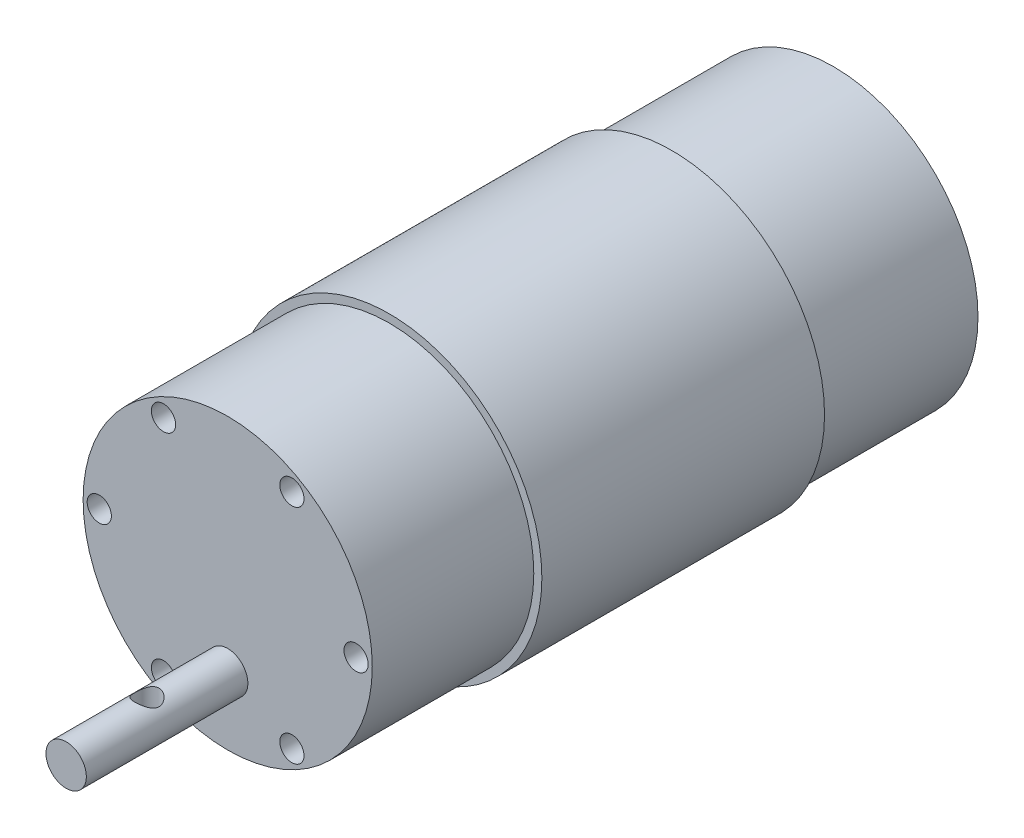
ISO-10303-21;
HEADER;
FILE_DESCRIPTION(('STEP AP214'),'2;1');
FILE_NAME('part.step','',(''),(''),'','','');
FILE_SCHEMA(('AUTOMOTIVE_DESIGN { 1 0 10303 214 1 1 1 1 }'));
ENDSEC;
DATA;
#1=APPLICATION_CONTEXT('core data for automotive mechanical design processes');
#2=APPLICATION_PROTOCOL_DEFINITION('international standard','automotive_design',2000,#1);
#3=PRODUCT_CONTEXT('',#1,'mechanical');
#4=PRODUCT('Part','Part','',(#3));
#5=PRODUCT_RELATED_PRODUCT_CATEGORY('part','',(#4));
#6=PRODUCT_DEFINITION_FORMATION('','',#4);
#7=PRODUCT_DEFINITION_CONTEXT('part definition',#1,'design');
#8=PRODUCT_DEFINITION('design','',#6,#7);
#9=PRODUCT_DEFINITION_SHAPE('','',#8);
#10=(LENGTH_UNIT() NAMED_UNIT(*) SI_UNIT(.MILLI.,.METRE.));
#11=(NAMED_UNIT(*) PLANE_ANGLE_UNIT() SI_UNIT($,.RADIAN.));
#12=(NAMED_UNIT(*) SI_UNIT($,.STERADIAN.) SOLID_ANGLE_UNIT());
#13=UNCERTAINTY_MEASURE_WITH_UNIT(LENGTH_MEASURE(1.E-05),#10,'distance_accuracy_value','');
#14=(GEOMETRIC_REPRESENTATION_CONTEXT(3) GLOBAL_UNCERTAINTY_ASSIGNED_CONTEXT((#13)) GLOBAL_UNIT_ASSIGNED_CONTEXT((#10,
#11,#12)) REPRESENTATION_CONTEXT('',''));
#15=CARTESIAN_POINT('',(0.,0.,0.));
#16=DIRECTION('',(0.,0.,1.));
#17=DIRECTION('',(1.,0.,0.));
#18=AXIS2_PLACEMENT_3D('',#15,#16,#17);
#19=CARTESIAN_POINT('',(0.,0.,75.));
#20=DIRECTION('',(0.,0.,-1.));
#21=DIRECTION('',(-1.,0.,0.));
#22=AXIS2_PLACEMENT_3D('',#19,#20,#21);
#23=CYLINDRICAL_SURFACE('',#22,18.9);
#24=CARTESIAN_POINT('',(0.,0.,55.));
#25=DIRECTION('',(0.,0.,1.));
#26=DIRECTION('',(1.,0.,0.));
#27=AXIS2_PLACEMENT_3D('',#24,#25,#26);
#28=CIRCLE('',#27,18.9);
#29=CARTESIAN_POINT('',(18.9,0.,55.));
#30=VERTEX_POINT('',#29);
#31=EDGE_CURVE('E159',#30,#30,#28,.T.);
#32=ORIENTED_EDGE('',*,*,#31,.F.);
#33=EDGE_LOOP('',(#32));
#34=FACE_BOUND('',#33,.T.);
#35=CARTESIAN_POINT('',(0.,0.,20.));
#36=DIRECTION('',(0.,0.,-1.));
#37=DIRECTION('',(-1.,0.,0.));
#38=AXIS2_PLACEMENT_3D('',#35,#36,#37);
#39=CIRCLE('',#38,18.9);
#40=CARTESIAN_POINT('',(-18.9,0.,20.));
#41=VERTEX_POINT('',#40);
#42=EDGE_CURVE('E162',#41,#41,#39,.T.);
#43=ORIENTED_EDGE('',*,*,#42,.F.);
#44=EDGE_LOOP('',(#43));
#45=FACE_BOUND('',#44,.T.);
#46=ADVANCED_FACE('F38',(#34,#45),#23,.T.);
#47=CARTESIAN_POINT('',(0.,0.,75.));
#48=DIRECTION('',(0.,0.,1.));
#49=DIRECTION('',(1.,0.,0.));
#50=AXIS2_PLACEMENT_3D('',#47,#48,#49);
#51=PLANE('',#50);
#52=CARTESIAN_POINT('',(7.94999999999997,-13.7698039201726,75.));
#53=DIRECTION('',(0.,0.,1.));
#54=DIRECTION('',(1.,0.,0.));
#55=AXIS2_PLACEMENT_3D('',#52,#53,#54);
#56=CIRCLE('',#55,1.5);
#57=CARTESIAN_POINT('',(9.44999999999997,-13.7698039201726,75.));
#58=VERTEX_POINT('',#57);
#59=EDGE_CURVE('E79',#58,#58,#56,.T.);
#60=ORIENTED_EDGE('',*,*,#59,.F.);
#61=EDGE_LOOP('',(#60));
#62=FACE_BOUND('',#61,.T.);
#63=CARTESIAN_POINT('',(-7.95000000000007,-13.7698039201725,75.));
#64=DIRECTION('',(0.,0.,1.));
#65=DIRECTION('',(1.,0.,0.));
#66=AXIS2_PLACEMENT_3D('',#63,#64,#65);
#67=CIRCLE('',#66,1.5);
#68=CARTESIAN_POINT('',(-6.45000000000007,-13.7698039201725,75.));
#69=VERTEX_POINT('',#68);
#70=EDGE_CURVE('E87',#69,#69,#67,.T.);
#71=ORIENTED_EDGE('',*,*,#70,.F.);
#72=EDGE_LOOP('',(#71));
#73=FACE_BOUND('',#72,.T.);
#74=CARTESIAN_POINT('',(-15.9,1.11029106575212E-13,75.));
#75=DIRECTION('',(0.,0.,1.));
#76=DIRECTION('',(1.,0.,0.));
#77=AXIS2_PLACEMENT_3D('',#74,#75,#76);
#78=CIRCLE('',#77,1.5);
#79=CARTESIAN_POINT('',(-14.4,1.11029106575212E-13,75.));
#80=VERTEX_POINT('',#79);
#81=EDGE_CURVE('E95',#80,#80,#78,.T.);
#82=ORIENTED_EDGE('',*,*,#81,.F.);
#83=EDGE_LOOP('',(#82));
#84=FACE_BOUND('',#83,.T.);
#85=CARTESIAN_POINT('',(-7.94999999999987,13.7698039201726,75.));
#86=DIRECTION('',(0.,0.,1.));
#87=DIRECTION('',(1.,0.,0.));
#88=AXIS2_PLACEMENT_3D('',#85,#86,#87);
#89=CIRCLE('',#88,1.5);
#90=CARTESIAN_POINT('',(-6.44999999999987,13.7698039201726,75.));
#91=VERTEX_POINT('',#90);
#92=EDGE_CURVE('E71',#91,#91,#89,.T.);
#93=ORIENTED_EDGE('',*,*,#92,.F.);
#94=EDGE_LOOP('',(#93));
#95=FACE_BOUND('',#94,.T.);
#96=CARTESIAN_POINT('',(7.95000000000016,13.7698039201725,75.));
#97=DIRECTION('',(0.,0.,1.));
#98=DIRECTION('',(1.,0.,0.));
#99=AXIS2_PLACEMENT_3D('',#96,#97,#98);
#100=CIRCLE('',#99,1.5);
#101=CARTESIAN_POINT('',(9.45000000000016,13.7698039201725,75.));
#102=VERTEX_POINT('',#101);
#103=EDGE_CURVE('E72',#102,#102,#100,.T.);
#104=ORIENTED_EDGE('',*,*,#103,.F.);
#105=EDGE_LOOP('',(#104));
#106=FACE_BOUND('',#105,.T.);
#107=CARTESIAN_POINT('',(15.9,0.,75.));
#108=DIRECTION('',(0.,0.,1.));
#109=DIRECTION('',(1.,0.,0.));
#110=AXIS2_PLACEMENT_3D('',#107,#108,#109);
#111=CIRCLE('',#110,1.5);
#112=CARTESIAN_POINT('',(17.4,0.,75.));
#113=VERTEX_POINT('',#112);
#114=EDGE_CURVE('E57',#113,#113,#111,.T.);
#115=ORIENTED_EDGE('',*,*,#114,.F.);
#116=EDGE_LOOP('',(#115));
#117=FACE_BOUND('',#116,.T.);
#118=CARTESIAN_POINT('',(0.,-9.5,75.));
#119=DIRECTION('',(0.,0.,1.));
#120=DIRECTION('',(1.,0.,0.));
#121=AXIS2_PLACEMENT_3D('',#118,#119,#120);
#122=CIRCLE('',#121,2.5);
#123=CARTESIAN_POINT('',(2.5,-9.5,75.));
#124=VERTEX_POINT('',#123);
#125=EDGE_CURVE('E10',#124,#124,#122,.T.);
#126=ORIENTED_EDGE('',*,*,#125,.F.);
#127=EDGE_LOOP('',(#126));
#128=FACE_BOUND('',#127,.T.);
#129=CARTESIAN_POINT('',(0.,0.,75.));
#130=DIRECTION('',(0.,0.,1.));
#131=DIRECTION('',(1.,0.,0.));
#132=AXIS2_PLACEMENT_3D('',#129,#130,#131);
#133=CIRCLE('',#132,17.9);
#134=CARTESIAN_POINT('',(17.9,0.,75.));
#135=VERTEX_POINT('',#134);
#136=EDGE_CURVE('E165',#135,#135,#133,.T.);
#137=ORIENTED_EDGE('',*,*,#136,.T.);
#138=EDGE_LOOP('',(#137));
#139=FACE_BOUND('',#138,.T.);
#140=ADVANCED_FACE('F148',(#62,#73,#84,#95,#106,#117,#128,#139),#51,.T.);
#141=CARTESIAN_POINT('',(7.94999999999997,-13.7698039201726,67.));
#142=DIRECTION('',(0.,0.,1.));
#143=DIRECTION('',(1.,0.,0.));
#144=AXIS2_PLACEMENT_3D('',#141,#142,#143);
#145=CYLINDRICAL_SURFACE('',#144,1.5);
#146=CARTESIAN_POINT('',(7.94999999999997,-13.7698039201726,67.));
#147=DIRECTION('',(0.,0.,1.));
#148=DIRECTION('',(1.,0.,0.));
#149=AXIS2_PLACEMENT_3D('',#146,#147,#148);
#150=CIRCLE('',#149,1.5);
#151=CARTESIAN_POINT('',(9.44999999999997,-13.7698039201726,67.));
#152=VERTEX_POINT('',#151);
#153=EDGE_CURVE('E66',#152,#152,#150,.T.);
#154=ORIENTED_EDGE('',*,*,#153,.F.);
#155=EDGE_LOOP('',(#154));
#156=FACE_BOUND('',#155,.T.);
#157=ORIENTED_EDGE('',*,*,#59,.T.);
#158=EDGE_LOOP('',(#157));
#159=FACE_BOUND('',#158,.T.);
#160=ADVANCED_FACE('F153',(#156,#159),#145,.F.);
#161=CARTESIAN_POINT('',(7.94999999999997,-13.7698039201726,67.));
#162=DIRECTION('',(0.,0.,1.));
#163=DIRECTION('',(1.,0.,0.));
#164=AXIS2_PLACEMENT_3D('',#161,#162,#163);
#165=PLANE('',#164);
#166=ORIENTED_EDGE('',*,*,#153,.T.);
#167=EDGE_LOOP('',(#166));
#168=FACE_BOUND('',#167,.T.);
#169=ADVANCED_FACE('F225',(#168),#165,.T.);
#170=CARTESIAN_POINT('',(-7.95000000000007,-13.7698039201725,67.));
#171=DIRECTION('',(0.,0.,1.));
#172=DIRECTION('',(1.,0.,0.));
#173=AXIS2_PLACEMENT_3D('',#170,#171,#172);
#174=CYLINDRICAL_SURFACE('',#173,1.5);
#175=CARTESIAN_POINT('',(-7.95000000000007,-13.7698039201725,67.));
#176=DIRECTION('',(0.,0.,1.));
#177=DIRECTION('',(1.,0.,0.));
#178=AXIS2_PLACEMENT_3D('',#175,#176,#177);
#179=CIRCLE('',#178,1.5);
#180=CARTESIAN_POINT('',(-6.45000000000007,-13.7698039201725,67.));
#181=VERTEX_POINT('',#180);
#182=EDGE_CURVE('E83',#181,#181,#179,.T.);
#183=ORIENTED_EDGE('',*,*,#182,.F.);
#184=EDGE_LOOP('',(#183));
#185=FACE_BOUND('',#184,.T.);
#186=ORIENTED_EDGE('',*,*,#70,.T.);
#187=EDGE_LOOP('',(#186));
#188=FACE_BOUND('',#187,.T.);
#189=ADVANCED_FACE('F222',(#185,#188),#174,.F.);
#190=CARTESIAN_POINT('',(-7.95000000000007,-13.7698039201725,67.));
#191=DIRECTION('',(0.,0.,1.));
#192=DIRECTION('',(1.,0.,0.));
#193=AXIS2_PLACEMENT_3D('',#190,#191,#192);
#194=PLANE('',#193);
#195=ORIENTED_EDGE('',*,*,#182,.T.);
#196=EDGE_LOOP('',(#195));
#197=FACE_BOUND('',#196,.T.);
#198=ADVANCED_FACE('F217',(#197),#194,.T.);
#199=CARTESIAN_POINT('',(-15.9,1.11029106575212E-13,67.));
#200=DIRECTION('',(0.,0.,1.));
#201=DIRECTION('',(1.,0.,0.));
#202=AXIS2_PLACEMENT_3D('',#199,#200,#201);
#203=CYLINDRICAL_SURFACE('',#202,1.5);
#204=CARTESIAN_POINT('',(-15.9,1.11029106575212E-13,67.));
#205=DIRECTION('',(0.,0.,1.));
#206=DIRECTION('',(1.,0.,0.));
#207=AXIS2_PLACEMENT_3D('',#204,#205,#206);
#208=CIRCLE('',#207,1.5);
#209=CARTESIAN_POINT('',(-14.4,1.11029106575212E-13,67.));
#210=VERTEX_POINT('',#209);
#211=EDGE_CURVE('E91',#210,#210,#208,.T.);
#212=ORIENTED_EDGE('',*,*,#211,.F.);
#213=EDGE_LOOP('',(#212));
#214=FACE_BOUND('',#213,.T.);
#215=ORIENTED_EDGE('',*,*,#81,.T.);
#216=EDGE_LOOP('',(#215));
#217=FACE_BOUND('',#216,.T.);
#218=ADVANCED_FACE('F214',(#214,#217),#203,.F.);
#219=CARTESIAN_POINT('',(-15.9,1.11029106575212E-13,67.));
#220=DIRECTION('',(0.,0.,1.));
#221=DIRECTION('',(1.,0.,0.));
#222=AXIS2_PLACEMENT_3D('',#219,#220,#221);
#223=PLANE('',#222);
#224=ORIENTED_EDGE('',*,*,#211,.T.);
#225=EDGE_LOOP('',(#224));
#226=FACE_BOUND('',#225,.T.);
#227=ADVANCED_FACE('F208',(#226),#223,.T.);
#228=CARTESIAN_POINT('',(-7.94999999999987,13.7698039201726,67.));
#229=DIRECTION('',(0.,0.,1.));
#230=DIRECTION('',(1.,0.,0.));
#231=AXIS2_PLACEMENT_3D('',#228,#229,#230);
#232=CYLINDRICAL_SURFACE('',#231,1.5);
#233=CARTESIAN_POINT('',(-7.94999999999987,13.7698039201726,67.));
#234=DIRECTION('',(0.,0.,1.));
#235=DIRECTION('',(1.,0.,0.));
#236=AXIS2_PLACEMENT_3D('',#233,#234,#235);
#237=CIRCLE('',#236,1.5);
#238=CARTESIAN_POINT('',(-6.44999999999987,13.7698039201726,67.));
#239=VERTEX_POINT('',#238);
#240=EDGE_CURVE('E99',#239,#239,#237,.T.);
#241=ORIENTED_EDGE('',*,*,#240,.F.);
#242=EDGE_LOOP('',(#241));
#243=FACE_BOUND('',#242,.T.);
#244=ORIENTED_EDGE('',*,*,#92,.T.);
#245=EDGE_LOOP('',(#244));
#246=FACE_BOUND('',#245,.T.);
#247=ADVANCED_FACE('F204',(#243,#246),#232,.F.);
#248=CARTESIAN_POINT('',(-7.94999999999987,13.7698039201726,67.));
#249=DIRECTION('',(0.,0.,1.));
#250=DIRECTION('',(1.,0.,0.));
#251=AXIS2_PLACEMENT_3D('',#248,#249,#250);
#252=PLANE('',#251);
#253=ORIENTED_EDGE('',*,*,#240,.T.);
#254=EDGE_LOOP('',(#253));
#255=FACE_BOUND('',#254,.T.);
#256=ADVANCED_FACE('F207',(#255),#252,.T.);
#257=CARTESIAN_POINT('',(7.95000000000016,13.7698039201725,67.));
#258=DIRECTION('',(0.,0.,1.));
#259=DIRECTION('',(1.,0.,0.));
#260=AXIS2_PLACEMENT_3D('',#257,#258,#259);
#261=CYLINDRICAL_SURFACE('',#260,1.5);
#262=CARTESIAN_POINT('',(7.95000000000016,13.7698039201725,67.));
#263=DIRECTION('',(0.,0.,1.));
#264=DIRECTION('',(1.,0.,0.));
#265=AXIS2_PLACEMENT_3D('',#262,#263,#264);
#266=CIRCLE('',#265,1.5);
#267=CARTESIAN_POINT('',(9.45000000000016,13.7698039201725,67.));
#268=VERTEX_POINT('',#267);
#269=EDGE_CURVE('E67',#268,#268,#266,.T.);
#270=ORIENTED_EDGE('',*,*,#269,.F.);
#271=EDGE_LOOP('',(#270));
#272=FACE_BOUND('',#271,.T.);
#273=ORIENTED_EDGE('',*,*,#103,.T.);
#274=EDGE_LOOP('',(#273));
#275=FACE_BOUND('',#274,.T.);
#276=ADVANCED_FACE('F212',(#272,#275),#261,.F.);
#277=CARTESIAN_POINT('',(7.95000000000016,13.7698039201725,67.));
#278=DIRECTION('',(0.,0.,1.));
#279=DIRECTION('',(1.,0.,0.));
#280=AXIS2_PLACEMENT_3D('',#277,#278,#279);
#281=PLANE('',#280);
#282=ORIENTED_EDGE('',*,*,#269,.T.);
#283=EDGE_LOOP('',(#282));
#284=FACE_BOUND('',#283,.T.);
#285=ADVANCED_FACE('F238',(#284),#281,.T.);
#286=CARTESIAN_POINT('',(15.9,0.,67.));
#287=DIRECTION('',(0.,0.,1.));
#288=DIRECTION('',(1.,0.,0.));
#289=AXIS2_PLACEMENT_3D('',#286,#287,#288);
#290=CYLINDRICAL_SURFACE('',#289,1.5);
#291=CARTESIAN_POINT('',(15.9,0.,67.));
#292=DIRECTION('',(0.,0.,1.));
#293=DIRECTION('',(1.,0.,0.));
#294=AXIS2_PLACEMENT_3D('',#291,#292,#293);
#295=CIRCLE('',#294,1.5);
#296=CARTESIAN_POINT('',(17.4,0.,67.));
#297=VERTEX_POINT('',#296);
#298=EDGE_CURVE('E51',#297,#297,#295,.T.);
#299=ORIENTED_EDGE('',*,*,#298,.F.);
#300=EDGE_LOOP('',(#299));
#301=FACE_BOUND('',#300,.T.);
#302=ORIENTED_EDGE('',*,*,#114,.T.);
#303=EDGE_LOOP('',(#302));
#304=FACE_BOUND('',#303,.T.);
#305=ADVANCED_FACE('F242',(#301,#304),#290,.F.);
#306=CARTESIAN_POINT('',(15.9,0.,67.));
#307=DIRECTION('',(0.,0.,1.));
#308=DIRECTION('',(1.,0.,0.));
#309=AXIS2_PLACEMENT_3D('',#306,#307,#308);
#310=PLANE('',#309);
#311=ORIENTED_EDGE('',*,*,#298,.T.);
#312=EDGE_LOOP('',(#311));
#313=FACE_BOUND('',#312,.T.);
#314=ADVANCED_FACE('F144',(#313),#310,.T.);
#315=CARTESIAN_POINT('',(0.,-9.5,95.));
#316=DIRECTION('',(0.,0.,-1.));
#317=DIRECTION('',(-1.,0.,0.));
#318=AXIS2_PLACEMENT_3D('',#315,#316,#317);
#319=CYLINDRICAL_SURFACE('',#318,2.5);
#320=CARTESIAN_POINT('',(0.,-12.,86.5));
#321=CARTESIAN_POINT('',(0.0767298334620158,-11.9999962578973,86.4999959089901));
#322=CARTESIAN_POINT('',(0.153582320644179,-11.9964290461501,86.4940713290737));
#323=CARTESIAN_POINT('',(0.30497550953068,-11.9824990360857,86.4706756804847));
#324=CARTESIAN_POINT('',(0.379510034596047,-11.9721194803272,86.4531761381458));
#325=CARTESIAN_POINT('',(0.523751827790841,-11.9456155805449,86.4076136388331));
#326=CARTESIAN_POINT('',(0.593481028226574,-11.9295197327294,86.3796030418368));
#327=CARTESIAN_POINT('',(0.727030318214667,-11.8929536762641,86.314139666859));
#328=CARTESIAN_POINT('',(0.790851869416389,-11.8724845538025,86.2766892330313));
#329=CARTESIAN_POINT('',(0.916299278999319,-11.8270536071909,86.1902251732914));
#330=CARTESIAN_POINT('',(0.977384020081418,-11.8018679219598,86.1405463046486));
#331=CARTESIAN_POINT('',(1.09088270411891,-11.7503043927963,86.0325327961717));
#332=CARTESIAN_POINT('',(1.14328534948113,-11.7239250515357,85.9741870628127));
#333=CARTESIAN_POINT('',(1.24444996762975,-11.6691106699591,85.8420764895033));
#334=CARTESIAN_POINT('',(1.29197766378809,-11.6408201770365,85.7672982290187));
#335=CARTESIAN_POINT('',(1.37361437764897,-11.5893830141212,85.6091534267569));
#336=CARTESIAN_POINT('',(1.4077451733516,-11.5662280227394,85.5258011037524));
#337=CARTESIAN_POINT('',(1.45440601714222,-11.5335462966093,85.3734035493468));
#338=CARTESIAN_POINT('',(1.47016197246826,-11.5220788313759,85.3057640013897));
#339=CARTESIAN_POINT('',(1.49216172340475,-11.505903082955,85.1681962841697));
#340=CARTESIAN_POINT('',(1.49841734556836,-11.5011863964376,85.0982710712455));
#341=CARTESIAN_POINT('',(1.50105508796009,-11.4992092246386,84.9579885057827));
#342=CARTESIAN_POINT('',(1.49741783408419,-11.5019633701272,84.8876305749068));
#343=CARTESIAN_POINT('',(1.48046060478828,-11.5145326144374,84.7487212245724));
#344=CARTESIAN_POINT('',(1.46713334620104,-11.5243530243223,84.6801712041526));
#345=CARTESIAN_POINT('',(1.43173921881793,-11.5495318694426,84.5474697578719));
#346=CARTESIAN_POINT('',(1.40978748666088,-11.5648171165254,84.4832729460755));
#347=CARTESIAN_POINT('',(1.35795061770838,-11.5992705135083,84.3593050090719));
#348=CARTESIAN_POINT('',(1.32806257259706,-11.6184400862346,84.2995355165761));
#349=CARTESIAN_POINT('',(1.25517983184584,-11.6625532726898,84.1750159028772));
#350=CARTESIAN_POINT('',(1.21080724397725,-11.6879204337299,84.1112219070451));
#351=CARTESIAN_POINT('',(1.11291092784005,-11.7393059976438,83.991323516333));
#352=CARTESIAN_POINT('',(1.05937845100581,-11.7653250026215,83.9352265660235));
#353=CARTESIAN_POINT('',(0.935811834382998,-11.8193550495832,83.8243870181783));
#354=CARTESIAN_POINT('',(0.864517682704986,-11.8471383626853,83.770922693984));
#355=CARTESIAN_POINT('',(0.712276050459028,-11.8977242843398,83.6768779528021));
#356=CARTESIAN_POINT('',(0.631333763943594,-11.9205295542551,83.6362906462101));
#357=CARTESIAN_POINT('',(0.467197585268237,-11.9573039206615,83.5720678172041));
#358=CARTESIAN_POINT('',(0.384467624173612,-11.971739574397,83.5475246442841));
#359=CARTESIAN_POINT('',(0.215047895144671,-11.9921884281355,83.5129888025946));
#360=CARTESIAN_POINT('',(0.12836300566135,-11.9982117295274,83.5029786822464));
#361=CARTESIAN_POINT('',(-0.0337146143773671,-12.0009057037461,83.4984921523217));
#362=CARTESIAN_POINT('',(-0.109042473418689,-11.9987352171429,83.5020911449148));
#363=CARTESIAN_POINT('',(-0.257829401986034,-11.9877871208705,83.5204258530719));
#364=CARTESIAN_POINT('',(-0.33128850937608,-11.9790096451804,83.5351613428058));
#365=CARTESIAN_POINT('',(-0.472574932157588,-11.9559479244219,83.5745434328124));
#366=CARTESIAN_POINT('',(-0.540495750928458,-11.9418027566256,83.5989403490735));
#367=CARTESIAN_POINT('',(-0.671265749087237,-11.9091388086285,83.6566773763653));
#368=CARTESIAN_POINT('',(-0.734113924963883,-11.8906191658651,83.6900192513467));
#369=CARTESIAN_POINT('',(-0.860006262823839,-11.8484549623736,83.7685569792087));
#370=CARTESIAN_POINT('',(-0.922394150456812,-11.8244780273988,83.8146238290784));
#371=CARTESIAN_POINT('',(-1.03902603131011,-11.7747426557473,83.9153913934886));
#372=CARTESIAN_POINT('',(-1.09326040273736,-11.7489821658636,83.9701021548525));
#373=CARTESIAN_POINT('',(-1.19931996735577,-11.6944542390989,84.0949103900371));
#374=CARTESIAN_POINT('',(-1.24991019630913,-11.6657324174629,84.1660838854655));
#375=CARTESIAN_POINT('',(-1.33845238915666,-11.6121618206671,84.3172160245682));
#376=CARTESIAN_POINT('',(-1.3764176676978,-11.5873089799769,84.3971652938928));
#377=CARTESIAN_POINT('',(-1.43142578795776,-11.5498490924052,84.5462430223067));
#378=CARTESIAN_POINT('',(-1.45121625336189,-11.5357565932873,84.6139803123586));
#379=CARTESIAN_POINT('',(-1.48113663905971,-11.5140960574354,84.7525320780801));
#380=CARTESIAN_POINT('',(-1.4912799529763,-11.5065189764272,84.8233421443278));
#381=CARTESIAN_POINT('',(-1.50134130416631,-11.4990044661627,84.966376947597));
#382=CARTESIAN_POINT('',(-1.50122089107869,-11.4990957644594,85.038605990687));
#383=CARTESIAN_POINT('',(-1.49066472959328,-11.5069771789285,85.1818944356095));
#384=CARTESIAN_POINT('',(-1.48022337215759,-11.5147714813882,85.2529531800806));
#385=CARTESIAN_POINT('',(-1.45040174148913,-11.5363318524298,85.3884884175722));
#386=CARTESIAN_POINT('',(-1.43147636845352,-11.5497921180558,85.4531170943069));
#387=CARTESIAN_POINT('',(-1.38563242076994,-11.5810550196015,85.5783372544742));
#388=CARTESIAN_POINT('',(-1.3587108358848,-11.5988592904048,85.6389272069605));
#389=CARTESIAN_POINT('',(-1.29289245555734,-11.6401299055092,85.7643198572208));
#390=CARTESIAN_POINT('',(-1.25279167675754,-11.6640458758264,85.8283411038543));
#391=CARTESIAN_POINT('',(-1.16375698389086,-11.7132012703077,85.9493800726173));
#392=CARTESIAN_POINT('',(-1.114815796078,-11.7384417720502,86.0063919621525));
#393=CARTESIAN_POINT('',(-1.00009777425736,-11.7922569029148,86.1213509491317));
#394=CARTESIAN_POINT('',(-0.932876819313924,-11.8207030866366,86.1779310748962));
#395=CARTESIAN_POINT('',(-0.788462434445611,-11.8736542887237,86.2790978558633));
#396=CARTESIAN_POINT('',(-0.711265444501566,-11.8981578931093,86.3236802119848));
#397=CARTESIAN_POINT('',(-0.551125230801482,-11.9398557865439,86.3977858075738));
#398=CARTESIAN_POINT('',(-0.46843008695724,-11.9572507747979,86.4277280649268));
#399=CARTESIAN_POINT('',(-0.29797330611883,-11.9836627300125,86.472724695211));
#400=CARTESIAN_POINT('',(-0.210232099648633,-11.9927112587149,86.487835167857));
#401=CARTESIAN_POINT('',(-0.101558096917553,-11.9980200116819,86.4966974547087));
#402=CARTESIAN_POINT('',(-0.0812762590282911,-11.9987611465636,86.4979344173061));
#403=CARTESIAN_POINT('',(-0.0406658206871195,-11.9997516451737,86.4995862463709));
#404=CARTESIAN_POINT('',(-0.020337218637573,-12.0000009918432,86.5000010843209));
#405=CARTESIAN_POINT('',(0.,-12.,86.5));
#406=B_SPLINE_CURVE_WITH_KNOTS('',3,(#320,#321,#322,#323,#324,#325,#326,#327,#328,#329,#330,
#331,#332,#333,#334,#335,#336,#337,#338,#339,#340,#341,#342,#343,#344,#345,#346,#347,#348,#349,
#350,#351,#352,#353,#354,#355,#356,#357,#358,#359,#360,#361,#362,#363,#364,#365,#366,#367,#368,
#369,#370,#371,#372,#373,#374,#375,#376,#377,#378,#379,#380,#381,#382,#383,#384,#385,#386,#387,
#388,#389,#390,#391,#392,#393,#394,#395,#396,#397,#398,#399,#400,#401,#402,#403,#404,#405),
.UNSPECIFIED.,.T.,.F.,(4,2,2,2,2,2,2,2,2,2,2,2,2,2,2,2,2,2,2,2,2,2,2,2,2,2,2,2,2,2,2,2,2,2,2,2,
2,2,2,2,2,2,4),(0.,0.230102237548649,0.460772627520014,0.690308884600027,0.919788197992278,
1.16681590732473,1.41416257934801,1.69183813189808,1.96906040692092,2.17933829855632,
2.38935420916577,2.59978170870724,2.81036753273869,3.01823267593204,3.22617409809866,
3.47046995225159,3.7150004480367,3.99360957884688,4.27206939275321,4.53296790696556,
4.79355286918233,5.01875602722423,5.24395461863452,5.46367785689769,5.68344445659022,
5.92601365818358,6.16886690081832,6.44336762428005,6.71757792616452,6.93257787314689,
7.14727888733316,7.3627842577743,7.57840681155723,7.7836409833114,7.98895251523033,
8.22578610052284,8.46281544370205,8.73854311775516,9.01436946031982,9.28175654462675,
9.54812832184447,9.60911473335176,9.67010326027641),.UNSPECIFIED.);
#407=CARTESIAN_POINT('',(0.,-12.,86.5));
#408=VERTEX_POINT('',#407);
#409=EDGE_CURVE('E41',#408,#408,#406,.T.);
#410=ORIENTED_EDGE('',*,*,#409,.T.);
#411=EDGE_LOOP('',(#410));
#412=FACE_BOUND('',#411,.T.);
#413=CARTESIAN_POINT('',(0.,-7.,86.5));
#414=CARTESIAN_POINT('',(-0.0767298334620151,-7.00000374210268,86.4999959089901));
#415=CARTESIAN_POINT('',(-0.153582320644177,-7.0035709538499,86.4940713290737));
#416=CARTESIAN_POINT('',(-0.304975509530678,-7.01750096391432,86.4706756804847));
#417=CARTESIAN_POINT('',(-0.379510034596047,-7.02788051967281,86.4531761381458));
#418=CARTESIAN_POINT('',(-0.523751827790841,-7.05438441945512,86.4076136388331));
#419=CARTESIAN_POINT('',(-0.593481028226573,-7.07048026727056,86.3796030418368));
#420=CARTESIAN_POINT('',(-0.727030318214667,-7.10704632373593,86.314139666859));
#421=CARTESIAN_POINT('',(-0.790851869416389,-7.12751544619745,86.2766892330313));
#422=CARTESIAN_POINT('',(-0.916299278999319,-7.17294639280913,86.1902251732914));
#423=CARTESIAN_POINT('',(-0.977384020081418,-7.19813207804015,86.1405463046486));
#424=CARTESIAN_POINT('',(-1.09088270411891,-7.24969560720366,86.0325327961717));
#425=CARTESIAN_POINT('',(-1.14328534948113,-7.2760749484643,85.9741870628127));
#426=CARTESIAN_POINT('',(-1.24444996762975,-7.3308893300409,85.8420764895033));
#427=CARTESIAN_POINT('',(-1.29197766378809,-7.35917982296351,85.7672982290187));
#428=CARTESIAN_POINT('',(-1.37361437764897,-7.41061698587876,85.6091534267569));
#429=CARTESIAN_POINT('',(-1.4077451733516,-7.43377197726063,85.5258011037524));
#430=CARTESIAN_POINT('',(-1.45440601714222,-7.4664537033907,85.3734035493468));
#431=CARTESIAN_POINT('',(-1.47016197246826,-7.47792116862409,85.3057640013897));
#432=CARTESIAN_POINT('',(-1.49216172340475,-7.49409691704497,85.1681962841697));
#433=CARTESIAN_POINT('',(-1.49841734556836,-7.4988136035624,85.0982710712455));
#434=CARTESIAN_POINT('',(-1.50105508796009,-7.50079077536144,84.9579885057827));
#435=CARTESIAN_POINT('',(-1.49741783408419,-7.49803662987282,84.8876305749068));
#436=CARTESIAN_POINT('',(-1.48046060478828,-7.48546738556259,84.7487212245724));
#437=CARTESIAN_POINT('',(-1.46713334620104,-7.47564697567775,84.6801712041526));
#438=CARTESIAN_POINT('',(-1.43173921881793,-7.45046813055743,84.5474697578719));
#439=CARTESIAN_POINT('',(-1.40978748666088,-7.43518288347463,84.4832729460755));
#440=CARTESIAN_POINT('',(-1.35795061770838,-7.40072948649172,84.3593050090719));
#441=CARTESIAN_POINT('',(-1.32806257259706,-7.38155991376536,84.2995355165761));
#442=CARTESIAN_POINT('',(-1.25517983184584,-7.33744672731016,84.1750159028772));
#443=CARTESIAN_POINT('',(-1.21080724397725,-7.31207956627009,84.1112219070451));
#444=CARTESIAN_POINT('',(-1.11291092784005,-7.2606940023562,83.991323516333));
#445=CARTESIAN_POINT('',(-1.05937845100581,-7.23467499737852,83.9352265660235));
#446=CARTESIAN_POINT('',(-0.935811834382998,-7.18064495041684,83.8243870181783));
#447=CARTESIAN_POINT('',(-0.864517682704985,-7.15286163731469,83.770922693984));
#448=CARTESIAN_POINT('',(-0.712276050459028,-7.1022757156602,83.6768779528021));
#449=CARTESIAN_POINT('',(-0.631333763943594,-7.07947044574485,83.6362906462101));
#450=CARTESIAN_POINT('',(-0.467197585268238,-7.04269607933849,83.5720678172041));
#451=CARTESIAN_POINT('',(-0.384467624173612,-7.02826042560297,83.5475246442841));
#452=CARTESIAN_POINT('',(-0.215047895144671,-7.0078115718645,83.5129888025946));
#453=CARTESIAN_POINT('',(-0.12836300566135,-7.00178827047262,83.5029786822464));
#454=CARTESIAN_POINT('',(0.0337146143773671,-6.9990942962539,83.4984921523217));
#455=CARTESIAN_POINT('',(0.109042473418689,-7.00126478285714,83.5020911449148));
#456=CARTESIAN_POINT('',(0.257829401986034,-7.01221287912951,83.5204258530719));
#457=CARTESIAN_POINT('',(0.33128850937608,-7.02099035481962,83.5351613428058));
#458=CARTESIAN_POINT('',(0.472574932157588,-7.04405207557809,83.5745434328124));
#459=CARTESIAN_POINT('',(0.540495750928458,-7.05819724337444,83.5989403490735));
#460=CARTESIAN_POINT('',(0.671265749087237,-7.09086119137155,83.6566773763653));
#461=CARTESIAN_POINT('',(0.734113924963883,-7.10938083413488,83.6900192513467));
#462=CARTESIAN_POINT('',(0.860006262823839,-7.15154503762639,83.7685569792087));
#463=CARTESIAN_POINT('',(0.922394150456812,-7.17552197260119,83.8146238290784));
#464=CARTESIAN_POINT('',(1.03902603131011,-7.22525734425267,83.9153913934886));
#465=CARTESIAN_POINT('',(1.09326040273736,-7.25101783413638,83.9701021548525));
#466=CARTESIAN_POINT('',(1.19931996735577,-7.30554576090108,84.0949103900371));
#467=CARTESIAN_POINT('',(1.24991019630913,-7.33426758253708,84.1660838854655));
#468=CARTESIAN_POINT('',(1.33845238915666,-7.38783817933289,84.3172160245682));
#469=CARTESIAN_POINT('',(1.3764176676978,-7.41269102002309,84.3971652938928));
#470=CARTESIAN_POINT('',(1.43142578795776,-7.4501509075948,84.5462430223067));
#471=CARTESIAN_POINT('',(1.45121625336189,-7.46424340671271,84.6139803123586));
#472=CARTESIAN_POINT('',(1.48113663905971,-7.48590394256456,84.7525320780801));
#473=CARTESIAN_POINT('',(1.4912799529763,-7.49348102357279,84.8233421443278));
#474=CARTESIAN_POINT('',(1.50134130416631,-7.50099553383732,84.966376947597));
#475=CARTESIAN_POINT('',(1.50122089107869,-7.50090423554063,85.038605990687));
#476=CARTESIAN_POINT('',(1.49066472959328,-7.4930228210715,85.1818944356095));
#477=CARTESIAN_POINT('',(1.48022337215759,-7.4852285186118,85.2529531800806));
#478=CARTESIAN_POINT('',(1.45040174148913,-7.4636681475702,85.3884884175722));
#479=CARTESIAN_POINT('',(1.43147636845352,-7.4502078819442,85.4531170943069));
#480=CARTESIAN_POINT('',(1.38563242076994,-7.41894498039849,85.5783372544742));
#481=CARTESIAN_POINT('',(1.3587108358848,-7.40114070959518,85.6389272069605));
#482=CARTESIAN_POINT('',(1.29289245555734,-7.35987009449084,85.7643198572208));
#483=CARTESIAN_POINT('',(1.25279167675755,-7.33595412417362,85.8283411038543));
#484=CARTESIAN_POINT('',(1.16375698389087,-7.28679872969234,85.9493800726173));
#485=CARTESIAN_POINT('',(1.114815796078,-7.2615582279498,86.0063919621525));
#486=CARTESIAN_POINT('',(1.00009777425736,-7.20774309708524,86.1213509491317));
#487=CARTESIAN_POINT('',(0.932876819313923,-7.17929691336343,86.1779310748962));
#488=CARTESIAN_POINT('',(0.78846243444561,-7.12634571127633,86.2790978558633));
#489=CARTESIAN_POINT('',(0.711265444501565,-7.10184210689065,86.3236802119848));
#490=CARTESIAN_POINT('',(0.551125230801481,-7.06014421345606,86.3977858075738));
#491=CARTESIAN_POINT('',(0.46843008695724,-7.04274922520214,86.4277280649268));
#492=CARTESIAN_POINT('',(0.29797330611883,-7.01633726998754,86.472724695211));
#493=CARTESIAN_POINT('',(0.210232099648633,-7.00728874128515,86.487835167857));
#494=CARTESIAN_POINT('',(0.101558096917552,-7.00197998831813,86.4966974547087));
#495=CARTESIAN_POINT('',(0.0812762590282901,-7.00123885343638,86.4979344173061));
#496=CARTESIAN_POINT('',(0.0406658206871186,-7.00024835482633,86.4995862463709));
#497=CARTESIAN_POINT('',(0.0203372186375726,-6.99999900815684,86.5000010843209));
#498=CARTESIAN_POINT('',(0.,-7.,86.5));
#499=B_SPLINE_CURVE_WITH_KNOTS('',3,(#413,#414,#415,#416,#417,#418,#419,#420,#421,#422,#423,
#424,#425,#426,#427,#428,#429,#430,#431,#432,#433,#434,#435,#436,#437,#438,#439,#440,#441,#442,
#443,#444,#445,#446,#447,#448,#449,#450,#451,#452,#453,#454,#455,#456,#457,#458,#459,#460,#461,
#462,#463,#464,#465,#466,#467,#468,#469,#470,#471,#472,#473,#474,#475,#476,#477,#478,#479,#480,
#481,#482,#483,#484,#485,#486,#487,#488,#489,#490,#491,#492,#493,#494,#495,#496,#497,#498),
.UNSPECIFIED.,.T.,.F.,(4,2,2,2,2,2,2,2,2,2,2,2,2,2,2,2,2,2,2,2,2,2,2,2,2,2,2,2,2,2,2,2,2,2,2,2,
2,2,2,2,2,2,4),(0.,0.230102237548647,0.460772627520014,0.690308884600026,0.919788197992277,
1.16681590732473,1.41416257934801,1.69183813189808,1.96906040692092,2.17933829855632,
2.38935420916577,2.59978170870724,2.81036753273869,3.01823267593204,3.22617409809866,
3.47046995225159,3.7150004480367,3.99360957884688,4.27206939275321,4.53296790696556,
4.79355286918233,5.01875602722423,5.24395461863452,5.46367785689769,5.68344445659022,
5.92601365818359,6.16886690081832,6.44336762428006,6.71757792616453,6.93257787314689,
7.14727888733316,7.3627842577743,7.57840681155723,7.7836409833114,7.98895251523034,
8.22578610052282,8.46281544370206,8.73854311775516,9.01436946031983,9.28175654462675,
9.54812832184447,9.60911473335177,9.67010326027641),.UNSPECIFIED.);
#500=CARTESIAN_POINT('',(0.,-7.,86.5));
#501=VERTEX_POINT('',#500);
#502=EDGE_CURVE('E105',#501,#501,#499,.T.);
#503=ORIENTED_EDGE('',*,*,#502,.T.);
#504=EDGE_LOOP('',(#503));
#505=FACE_BOUND('',#504,.T.);
#506=CARTESIAN_POINT('',(0.,-9.5,95.));
#507=DIRECTION('',(0.,0.,1.));
#508=DIRECTION('',(1.,0.,0.));
#509=AXIS2_PLACEMENT_3D('',#506,#507,#508);
#510=CIRCLE('',#509,2.5);
#511=CARTESIAN_POINT('',(2.5,-9.5,95.));
#512=VERTEX_POINT('',#511);
#513=EDGE_CURVE('E60',#512,#512,#510,.T.);
#514=ORIENTED_EDGE('',*,*,#513,.F.);
#515=EDGE_LOOP('',(#514));
#516=FACE_BOUND('',#515,.T.);
#517=ORIENTED_EDGE('',*,*,#125,.T.);
#518=EDGE_LOOP('',(#517));
#519=FACE_BOUND('',#518,.T.);
#520=ADVANCED_FACE('F111',(#412,#505,#516,#519),#319,.T.);
#521=CARTESIAN_POINT('',(0.,-9.5,95.));
#522=DIRECTION('',(0.,0.,1.));
#523=DIRECTION('',(1.,0.,0.));
#524=AXIS2_PLACEMENT_3D('',#521,#522,#523);
#525=PLANE('',#524);
#526=ORIENTED_EDGE('',*,*,#513,.T.);
#527=EDGE_LOOP('',(#526));
#528=FACE_BOUND('',#527,.T.);
#529=ADVANCED_FACE('F136',(#528),#525,.T.);
#530=CARTESIAN_POINT('',(0.,0.,55.));
#531=DIRECTION('',(0.,0.,1.));
#532=DIRECTION('',(1.,0.,0.));
#533=AXIS2_PLACEMENT_3D('',#530,#531,#532);
#534=PLANE('',#533);
#535=CARTESIAN_POINT('',(0.,0.,55.));
#536=DIRECTION('',(0.,0.,1.));
#537=DIRECTION('',(1.,0.,0.));
#538=AXIS2_PLACEMENT_3D('',#535,#536,#537);
#539=CIRCLE('',#538,17.9);
#540=CARTESIAN_POINT('',(17.9,0.,55.));
#541=VERTEX_POINT('',#540);
#542=EDGE_CURVE('E171',#541,#541,#539,.T.);
#543=ORIENTED_EDGE('',*,*,#542,.F.);
#544=EDGE_LOOP('',(#543));
#545=FACE_BOUND('',#544,.T.);
#546=ORIENTED_EDGE('',*,*,#31,.T.);
#547=EDGE_LOOP('',(#546));
#548=FACE_BOUND('',#547,.T.);
#549=ADVANCED_FACE('F133',(#545,#548),#534,.T.);
#550=CARTESIAN_POINT('',(0.,0.,55.));
#551=DIRECTION('',(0.,0.,1.));
#552=DIRECTION('',(1.,0.,0.));
#553=AXIS2_PLACEMENT_3D('',#550,#551,#552);
#554=CYLINDRICAL_SURFACE('',#553,17.9);
#555=ORIENTED_EDGE('',*,*,#542,.T.);
#556=EDGE_LOOP('',(#555));
#557=FACE_BOUND('',#556,.T.);
#558=ORIENTED_EDGE('',*,*,#136,.F.);
#559=EDGE_LOOP('',(#558));
#560=FACE_BOUND('',#559,.T.);
#561=ADVANCED_FACE('F129',(#557,#560),#554,.T.);
#562=CARTESIAN_POINT('',(0.,0.,20.));
#563=DIRECTION('',(0.,0.,-1.));
#564=DIRECTION('',(-1.,0.,0.));
#565=AXIS2_PLACEMENT_3D('',#562,#563,#564);
#566=PLANE('',#565);
#567=CARTESIAN_POINT('',(0.,0.,20.));
#568=DIRECTION('',(0.,0.,-1.));
#569=DIRECTION('',(-1.,0.,0.));
#570=AXIS2_PLACEMENT_3D('',#567,#568,#569);
#571=CIRCLE('',#570,17.9);
#572=CARTESIAN_POINT('',(-17.9,0.,20.));
#573=VERTEX_POINT('',#572);
#574=EDGE_CURVE('E166',#573,#573,#571,.T.);
#575=ORIENTED_EDGE('',*,*,#574,.F.);
#576=EDGE_LOOP('',(#575));
#577=FACE_BOUND('',#576,.T.);
#578=ORIENTED_EDGE('',*,*,#42,.T.);
#579=EDGE_LOOP('',(#578));
#580=FACE_BOUND('',#579,.T.);
#581=ADVANCED_FACE('F125',(#577,#580),#566,.T.);
#582=CARTESIAN_POINT('',(0.,0.,20.));
#583=DIRECTION('',(0.,0.,-1.));
#584=DIRECTION('',(-1.,0.,0.));
#585=AXIS2_PLACEMENT_3D('',#582,#583,#584);
#586=CYLINDRICAL_SURFACE('',#585,17.9);
#587=ORIENTED_EDGE('',*,*,#574,.T.);
#588=EDGE_LOOP('',(#587));
#589=FACE_BOUND('',#588,.T.);
#590=CARTESIAN_POINT('',(0.,0.,0.));
#591=DIRECTION('',(0.,0.,-1.));
#592=DIRECTION('',(-1.,0.,0.));
#593=AXIS2_PLACEMENT_3D('',#590,#591,#592);
#594=CIRCLE('',#593,17.9);
#595=CARTESIAN_POINT('',(-17.9,0.,0.));
#596=VERTEX_POINT('',#595);
#597=EDGE_CURVE('E174',#596,#596,#594,.T.);
#598=ORIENTED_EDGE('',*,*,#597,.F.);
#599=EDGE_LOOP('',(#598));
#600=FACE_BOUND('',#599,.T.);
#601=ADVANCED_FACE('F121',(#589,#600),#586,.T.);
#602=CARTESIAN_POINT('',(0.,0.,0.));
#603=DIRECTION('',(0.,0.,1.));
#604=DIRECTION('',(1.,0.,0.));
#605=AXIS2_PLACEMENT_3D('',#602,#603,#604);
#606=PLANE('',#605);
#607=ORIENTED_EDGE('',*,*,#597,.T.);
#608=EDGE_LOOP('',(#607));
#609=FACE_BOUND('',#608,.T.);
#610=ADVANCED_FACE('F119',(#609),#606,.F.);
#611=CARTESIAN_POINT('',(0.,-18.9,85.));
#612=DIRECTION('',(0.,1.,0.));
#613=DIRECTION('',(0.,0.,1.));
#614=AXIS2_PLACEMENT_3D('',#611,#612,#613);
#615=CYLINDRICAL_SURFACE('',#614,1.5);
#616=ORIENTED_EDGE('',*,*,#502,.F.);
#617=EDGE_LOOP('',(#616));
#618=FACE_BOUND('',#617,.T.);
#619=ORIENTED_EDGE('',*,*,#409,.F.);
#620=EDGE_LOOP('',(#619));
#621=FACE_BOUND('',#620,.T.);
#622=ADVANCED_FACE('F115',(#618,#621),#615,.F.);
#623=CLOSED_SHELL('',(#46,#140,#160,#169,#189,#198,#218,#227,#247,#256,#276,#285,#305,#314,#520,
#529,#549,#561,#581,#601,#610,#622));
#624=MANIFOLD_SOLID_BREP('B2',#623);
#625=ADVANCED_BREP_SHAPE_REPRESENTATION('',(#18,#624),#14);
#626=SHAPE_DEFINITION_REPRESENTATION(#9,#625);
ENDSEC;
END-ISO-10303-21;
